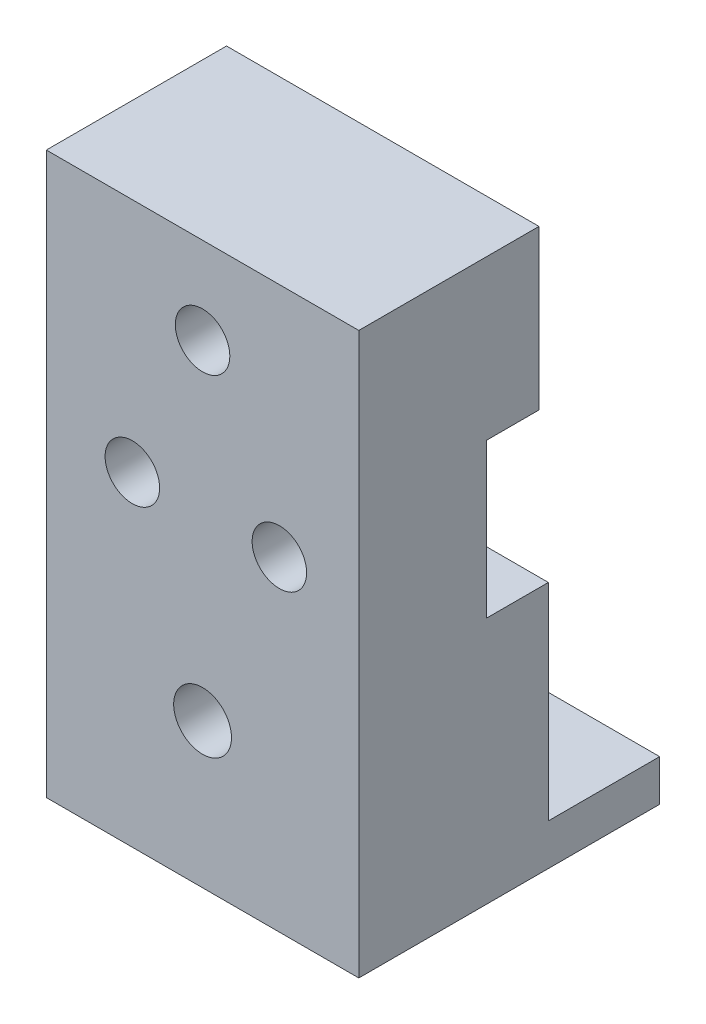
ISO-10303-21;
HEADER;
FILE_DESCRIPTION(('STEP AP214'),'2;1');
FILE_NAME('part.step','',(''),(''),'','','');
FILE_SCHEMA(('AUTOMOTIVE_DESIGN { 1 0 10303 214 1 1 1 1 }'));
ENDSEC;
DATA;
#1=APPLICATION_CONTEXT('core data for automotive mechanical design processes');
#2=APPLICATION_PROTOCOL_DEFINITION('international standard','automotive_design',2000,#1);
#3=PRODUCT_CONTEXT('',#1,'mechanical');
#4=PRODUCT('Part','Part','',(#3));
#5=PRODUCT_RELATED_PRODUCT_CATEGORY('part','',(#4));
#6=PRODUCT_DEFINITION_FORMATION('','',#4);
#7=PRODUCT_DEFINITION_CONTEXT('part definition',#1,'design');
#8=PRODUCT_DEFINITION('design','',#6,#7);
#9=PRODUCT_DEFINITION_SHAPE('','',#8);
#10=(LENGTH_UNIT() NAMED_UNIT(*) SI_UNIT(.MILLI.,.METRE.));
#11=(NAMED_UNIT(*) PLANE_ANGLE_UNIT() SI_UNIT($,.RADIAN.));
#12=(NAMED_UNIT(*) SI_UNIT($,.STERADIAN.) SOLID_ANGLE_UNIT());
#13=UNCERTAINTY_MEASURE_WITH_UNIT(LENGTH_MEASURE(1.E-05),#10,'distance_accuracy_value','');
#14=(GEOMETRIC_REPRESENTATION_CONTEXT(3) GLOBAL_UNCERTAINTY_ASSIGNED_CONTEXT((#13)) GLOBAL_UNIT_ASSIGNED_CONTEXT((#10,
#11,#12)) REPRESENTATION_CONTEXT('',''));
#15=CARTESIAN_POINT('',(0.,0.,0.));
#16=DIRECTION('',(0.,0.,1.));
#17=DIRECTION('',(1.,0.,0.));
#18=AXIS2_PLACEMENT_3D('',#15,#16,#17);
#19=CARTESIAN_POINT('',(18.915,0.,18.925));
#20=DIRECTION('',(0.,-1.,0.));
#21=DIRECTION('',(0.,0.,-1.));
#22=AXIS2_PLACEMENT_3D('',#19,#20,#21);
#23=PLANE('',#22);
#24=DIRECTION('',(0.,0.,1.));
#25=VECTOR('',#24,1.);
#26=CARTESIAN_POINT('',(-18.915,0.,18.925));
#27=LINE('',#26,#25);
#28=CARTESIAN_POINT('',(-18.915,0.,-2.88943811962644));
#29=VERTEX_POINT('',#28);
#30=CARTESIAN_POINT('',(-18.915,0.,18.925));
#31=VERTEX_POINT('',#30);
#32=EDGE_CURVE('E155',#29,#31,#27,.T.);
#33=ORIENTED_EDGE('',*,*,#32,.T.);
#34=DIRECTION('',(-1.,0.,0.));
#35=VECTOR('',#34,1.);
#36=CARTESIAN_POINT('',(18.915,0.,18.925));
#37=LINE('',#36,#35);
#38=CARTESIAN_POINT('',(18.915,0.,18.925));
#39=VERTEX_POINT('',#38);
#40=EDGE_CURVE('E11',#39,#31,#37,.T.);
#41=ORIENTED_EDGE('',*,*,#40,.F.);
#42=DIRECTION('',(0.,0.,1.));
#43=VECTOR('',#42,1.);
#44=CARTESIAN_POINT('',(18.915,0.,18.925));
#45=LINE('',#44,#43);
#46=CARTESIAN_POINT('',(18.915,0.,-2.88943811962644));
#47=VERTEX_POINT('',#46);
#48=EDGE_CURVE('E173',#47,#39,#45,.T.);
#49=ORIENTED_EDGE('',*,*,#48,.F.);
#50=DIRECTION('',(-1.,0.,0.));
#51=VECTOR('',#50,1.);
#52=CARTESIAN_POINT('',(18.915,0.,-2.88943811962644));
#53=LINE('',#52,#51);
#54=EDGE_CURVE('E151',#47,#29,#53,.T.);
#55=ORIENTED_EDGE('',*,*,#54,.T.);
#56=EDGE_LOOP('',(#33,#41,#49,#55));
#57=FACE_BOUND('',#56,.T.);
#58=ADVANCED_FACE('F45',(#57),#23,.F.);
#59=CARTESIAN_POINT('',(18.915,0.,18.925));
#60=DIRECTION('',(0.,0.,-1.));
#61=DIRECTION('',(0.,1.,0.));
#62=AXIS2_PLACEMENT_3D('',#59,#60,#61);
#63=PLANE('',#62);
#64=CARTESIAN_POINT('',(0.,-50.4,18.925));
#65=DIRECTION('',(0.,0.,1.));
#66=DIRECTION('',(1.,0.,0.));
#67=AXIS2_PLACEMENT_3D('',#64,#65,#66);
#68=CIRCLE('',#67,3.5);
#69=CARTESIAN_POINT('',(3.5,-50.4,18.925));
#70=VERTEX_POINT('',#69);
#71=EDGE_CURVE('E195',#70,#70,#68,.T.);
#72=ORIENTED_EDGE('',*,*,#71,.F.);
#73=EDGE_LOOP('',(#72));
#74=FACE_BOUND('',#73,.T.);
#75=CARTESIAN_POINT('',(0.,-10.5,18.925));
#76=DIRECTION('',(0.,0.,1.));
#77=DIRECTION('',(1.,0.,0.));
#78=AXIS2_PLACEMENT_3D('',#75,#76,#77);
#79=CIRCLE('',#78,3.3);
#80=CARTESIAN_POINT('',(3.3,-10.5,18.925));
#81=VERTEX_POINT('',#80);
#82=EDGE_CURVE('E298',#81,#81,#79,.T.);
#83=ORIENTED_EDGE('',*,*,#82,.F.);
#84=EDGE_LOOP('',(#83));
#85=FACE_BOUND('',#84,.T.);
#86=CARTESIAN_POINT('',(-8.50107698298528,-28.575,18.925));
#87=DIRECTION('',(0.,0.,1.));
#88=DIRECTION('',(1.,0.,0.));
#89=AXIS2_PLACEMENT_3D('',#86,#87,#88);
#90=CIRCLE('',#89,3.3);
#91=CARTESIAN_POINT('',(-5.20107698298528,-28.575,18.925));
#92=VERTEX_POINT('',#91);
#93=EDGE_CURVE('E301',#92,#92,#90,.T.);
#94=ORIENTED_EDGE('',*,*,#93,.F.);
#95=EDGE_LOOP('',(#94));
#96=FACE_BOUND('',#95,.T.);
#97=CARTESIAN_POINT('',(9.29892301701472,-28.575,18.925));
#98=DIRECTION('',(0.,0.,1.));
#99=DIRECTION('',(1.,0.,0.));
#100=AXIS2_PLACEMENT_3D('',#97,#98,#99);
#101=CIRCLE('',#100,3.3);
#102=CARTESIAN_POINT('',(12.5989230170147,-28.575,18.925));
#103=VERTEX_POINT('',#102);
#104=EDGE_CURVE('E305',#103,#103,#101,.T.);
#105=ORIENTED_EDGE('',*,*,#104,.F.);
#106=EDGE_LOOP('',(#105));
#107=FACE_BOUND('',#106,.T.);
#108=DIRECTION('',(0.,-1.,0.));
#109=VECTOR('',#108,1.);
#110=CARTESIAN_POINT('',(-18.915,0.,18.925));
#111=LINE('',#110,#109);
#112=CARTESIAN_POINT('',(-18.915,-67.9,18.925));
#113=VERTEX_POINT('',#112);
#114=EDGE_CURVE('E158',#31,#113,#111,.T.);
#115=ORIENTED_EDGE('',*,*,#114,.T.);
#116=DIRECTION('',(-1.,0.,0.));
#117=VECTOR('',#116,1.);
#118=CARTESIAN_POINT('',(18.915,-67.9,18.925));
#119=LINE('',#118,#117);
#120=CARTESIAN_POINT('',(18.915,-67.9,18.925));
#121=VERTEX_POINT('',#120);
#122=EDGE_CURVE('E54',#121,#113,#119,.T.);
#123=ORIENTED_EDGE('',*,*,#122,.F.);
#124=DIRECTION('',(0.,-1.,0.));
#125=VECTOR('',#124,1.);
#126=CARTESIAN_POINT('',(18.915,0.,18.925));
#127=LINE('',#126,#125);
#128=EDGE_CURVE('E112',#39,#121,#127,.T.);
#129=ORIENTED_EDGE('',*,*,#128,.F.);
#130=ORIENTED_EDGE('',*,*,#40,.T.);
#131=EDGE_LOOP('',(#115,#123,#129,#130));
#132=FACE_BOUND('',#131,.T.);
#133=ADVANCED_FACE('F221',(#74,#85,#96,#107,#132),#63,.F.);
#134=CARTESIAN_POINT('',(18.915,-67.9,-17.5));
#135=DIRECTION('',(0.,1.,0.));
#136=DIRECTION('',(0.,0.,1.));
#137=AXIS2_PLACEMENT_3D('',#134,#135,#136);
#138=PLANE('',#137);
#139=DIRECTION('',(0.,0.,-1.));
#140=VECTOR('',#139,1.);
#141=CARTESIAN_POINT('',(-18.915,-67.9,-17.5));
#142=LINE('',#141,#140);
#143=CARTESIAN_POINT('',(-18.915,-67.9,-17.5));
#144=VERTEX_POINT('',#143);
#145=EDGE_CURVE('E160',#113,#144,#142,.T.);
#146=ORIENTED_EDGE('',*,*,#145,.T.);
#147=DIRECTION('',(-1.,0.,0.));
#148=VECTOR('',#147,1.);
#149=CARTESIAN_POINT('',(18.915,-67.9,-17.5));
#150=LINE('',#149,#148);
#151=CARTESIAN_POINT('',(18.915,-67.9,-17.5));
#152=VERTEX_POINT('',#151);
#153=EDGE_CURVE('E186',#152,#144,#150,.T.);
#154=ORIENTED_EDGE('',*,*,#153,.F.);
#155=DIRECTION('',(0.,0.,-1.));
#156=VECTOR('',#155,1.);
#157=CARTESIAN_POINT('',(18.915,-67.9,-17.5));
#158=LINE('',#157,#156);
#159=EDGE_CURVE('E239',#121,#152,#158,.T.);
#160=ORIENTED_EDGE('',*,*,#159,.F.);
#161=ORIENTED_EDGE('',*,*,#122,.T.);
#162=EDGE_LOOP('',(#146,#154,#160,#161));
#163=FACE_BOUND('',#162,.T.);
#164=ADVANCED_FACE('F227',(#163),#138,.F.);
#165=CARTESIAN_POINT('',(18.915,-67.9,-17.5));
#166=DIRECTION('',(0.,0.,1.));
#167=DIRECTION('',(1.,0.,0.));
#168=AXIS2_PLACEMENT_3D('',#165,#166,#167);
#169=PLANE('',#168);
#170=DIRECTION('',(0.,1.,0.));
#171=VECTOR('',#170,1.);
#172=CARTESIAN_POINT('',(-18.915,-67.9,-17.5));
#173=LINE('',#172,#171);
#174=CARTESIAN_POINT('',(-18.915,-62.9,-17.5));
#175=VERTEX_POINT('',#174);
#176=EDGE_CURVE('E162',#144,#175,#173,.T.);
#177=ORIENTED_EDGE('',*,*,#176,.T.);
#178=DIRECTION('',(-1.,0.,0.));
#179=VECTOR('',#178,1.);
#180=CARTESIAN_POINT('',(18.915,-62.9,-17.5));
#181=LINE('',#180,#179);
#182=CARTESIAN_POINT('',(18.915,-62.9,-17.5));
#183=VERTEX_POINT('',#182);
#184=EDGE_CURVE('E183',#183,#175,#181,.T.);
#185=ORIENTED_EDGE('',*,*,#184,.F.);
#186=DIRECTION('',(0.,1.,0.));
#187=VECTOR('',#186,1.);
#188=CARTESIAN_POINT('',(18.915,-67.9,-17.5));
#189=LINE('',#188,#187);
#190=EDGE_CURVE('E241',#152,#183,#189,.T.);
#191=ORIENTED_EDGE('',*,*,#190,.F.);
#192=ORIENTED_EDGE('',*,*,#153,.T.);
#193=EDGE_LOOP('',(#177,#185,#191,#192));
#194=FACE_BOUND('',#193,.T.);
#195=ADVANCED_FACE('F263',(#194),#169,.F.);
#196=CARTESIAN_POINT('',(18.915,-62.9,-4.02516782305241));
#197=DIRECTION('',(0.,-1.,0.));
#198=DIRECTION('',(0.,0.,-1.));
#199=AXIS2_PLACEMENT_3D('',#196,#197,#198);
#200=PLANE('',#199);
#201=DIRECTION('',(0.,0.,1.));
#202=VECTOR('',#201,1.);
#203=CARTESIAN_POINT('',(-18.915,-62.9,-4.02516782305241));
#204=LINE('',#203,#202);
#205=CARTESIAN_POINT('',(-18.915,-62.9,-4.02516782305241));
#206=VERTEX_POINT('',#205);
#207=EDGE_CURVE('E164',#175,#206,#204,.T.);
#208=ORIENTED_EDGE('',*,*,#207,.T.);
#209=DIRECTION('',(-1.,0.,0.));
#210=VECTOR('',#209,1.);
#211=CARTESIAN_POINT('',(18.915,-62.9,-4.02516782305241));
#212=LINE('',#211,#210);
#213=CARTESIAN_POINT('',(18.915,-62.9,-4.02516782305241));
#214=VERTEX_POINT('',#213);
#215=EDGE_CURVE('E180',#214,#206,#212,.T.);
#216=ORIENTED_EDGE('',*,*,#215,.F.);
#217=DIRECTION('',(0.,0.,1.));
#218=VECTOR('',#217,1.);
#219=CARTESIAN_POINT('',(18.915,-62.9,-4.02516782305241));
#220=LINE('',#219,#218);
#221=EDGE_CURVE('E243',#183,#214,#220,.T.);
#222=ORIENTED_EDGE('',*,*,#221,.F.);
#223=ORIENTED_EDGE('',*,*,#184,.T.);
#224=EDGE_LOOP('',(#208,#216,#222,#223));
#225=FACE_BOUND('',#224,.T.);
#226=ADVANCED_FACE('F260',(#225),#200,.F.);
#227=CARTESIAN_POINT('',(18.915,-37.9,-4.02516782305241));
#228=DIRECTION('',(0.,0.,1.));
#229=DIRECTION('',(1.,0.,0.));
#230=AXIS2_PLACEMENT_3D('',#227,#228,#229);
#231=PLANE('',#230);
#232=CARTESIAN_POINT('',(0.,-50.4,-4.02516782305241));
#233=DIRECTION('',(0.,0.,1.));
#234=DIRECTION('',(1.,0.,0.));
#235=AXIS2_PLACEMENT_3D('',#232,#233,#234);
#236=CIRCLE('',#235,3.5);
#237=CARTESIAN_POINT('',(3.5,-50.4,-4.02516782305241));
#238=VERTEX_POINT('',#237);
#239=EDGE_CURVE('E48',#238,#238,#236,.T.);
#240=ORIENTED_EDGE('',*,*,#239,.T.);
#241=EDGE_LOOP('',(#240));
#242=FACE_BOUND('',#241,.T.);
#243=DIRECTION('',(0.,1.,0.));
#244=VECTOR('',#243,1.);
#245=CARTESIAN_POINT('',(-18.915,-37.9,-4.02516782305241));
#246=LINE('',#245,#244);
#247=CARTESIAN_POINT('',(-18.915,-37.9,-4.02516782305241));
#248=VERTEX_POINT('',#247);
#249=EDGE_CURVE('E166',#206,#248,#246,.T.);
#250=ORIENTED_EDGE('',*,*,#249,.T.);
#251=DIRECTION('',(-1.,0.,0.));
#252=VECTOR('',#251,1.);
#253=CARTESIAN_POINT('',(18.915,-37.9,-4.02516782305241));
#254=LINE('',#253,#252);
#255=CARTESIAN_POINT('',(18.915,-37.9,-4.02516782305241));
#256=VERTEX_POINT('',#255);
#257=EDGE_CURVE('E177',#256,#248,#254,.T.);
#258=ORIENTED_EDGE('',*,*,#257,.F.);
#259=DIRECTION('',(0.,1.,0.));
#260=VECTOR('',#259,1.);
#261=CARTESIAN_POINT('',(18.915,-37.9,-4.02516782305241));
#262=LINE('',#261,#260);
#263=EDGE_CURVE('E249',#214,#256,#262,.T.);
#264=ORIENTED_EDGE('',*,*,#263,.F.);
#265=ORIENTED_EDGE('',*,*,#215,.T.);
#266=EDGE_LOOP('',(#250,#258,#264,#265));
#267=FACE_BOUND('',#266,.T.);
#268=ADVANCED_FACE('F204',(#242,#267),#231,.F.);
#269=CARTESIAN_POINT('',(18.915,-37.9,3.46056188037356));
#270=DIRECTION('',(0.,-1.,0.));
#271=DIRECTION('',(0.,0.,-1.));
#272=AXIS2_PLACEMENT_3D('',#269,#270,#271);
#273=PLANE('',#272);
#274=DIRECTION('',(0.,0.,1.));
#275=VECTOR('',#274,1.);
#276=CARTESIAN_POINT('',(-18.915,-37.9,3.46056188037356));
#277=LINE('',#276,#275);
#278=CARTESIAN_POINT('',(-18.915,-37.9,3.46056188037356));
#279=VERTEX_POINT('',#278);
#280=EDGE_CURVE('E168',#248,#279,#277,.T.);
#281=ORIENTED_EDGE('',*,*,#280,.T.);
#282=DIRECTION('',(-1.,0.,0.));
#283=VECTOR('',#282,1.);
#284=CARTESIAN_POINT('',(18.915,-37.9,3.46056188037356));
#285=LINE('',#284,#283);
#286=CARTESIAN_POINT('',(18.915,-37.9,3.46056188037356));
#287=VERTEX_POINT('',#286);
#288=EDGE_CURVE('E146',#287,#279,#285,.T.);
#289=ORIENTED_EDGE('',*,*,#288,.F.);
#290=DIRECTION('',(0.,0.,1.));
#291=VECTOR('',#290,1.);
#292=CARTESIAN_POINT('',(18.915,-37.9,3.46056188037356));
#293=LINE('',#292,#291);
#294=EDGE_CURVE('E137',#256,#287,#293,.T.);
#295=ORIENTED_EDGE('',*,*,#294,.F.);
#296=ORIENTED_EDGE('',*,*,#257,.T.);
#297=EDGE_LOOP('',(#281,#289,#295,#296));
#298=FACE_BOUND('',#297,.T.);
#299=ADVANCED_FACE('F257',(#298),#273,.F.);
#300=CARTESIAN_POINT('',(18.915,-19.25,3.46056188037356));
#301=DIRECTION('',(0.,0.,1.));
#302=DIRECTION('',(0.,-1.,0.));
#303=AXIS2_PLACEMENT_3D('',#300,#301,#302);
#304=PLANE('',#303);
#305=CARTESIAN_POINT('',(-8.50107698298528,-28.575,3.46056188037356));
#306=DIRECTION('',(0.,0.,1.));
#307=DIRECTION('',(0.,-1.,0.));
#308=AXIS2_PLACEMENT_3D('',#305,#306,#307);
#309=CIRCLE('',#308,3.3);
#310=CARTESIAN_POINT('',(-8.50107698298528,-31.875,3.46056188037356));
#311=VERTEX_POINT('',#310);
#312=EDGE_CURVE('E197',#311,#311,#309,.T.);
#313=ORIENTED_EDGE('',*,*,#312,.T.);
#314=EDGE_LOOP('',(#313));
#315=FACE_BOUND('',#314,.T.);
#316=CARTESIAN_POINT('',(9.29892301701472,-28.575,3.46056188037356));
#317=DIRECTION('',(0.,0.,1.));
#318=DIRECTION('',(0.,-1.,0.));
#319=AXIS2_PLACEMENT_3D('',#316,#317,#318);
#320=CIRCLE('',#319,3.3);
#321=CARTESIAN_POINT('',(9.29892301701472,-31.875,3.46056188037356));
#322=VERTEX_POINT('',#321);
#323=EDGE_CURVE('E194',#322,#322,#320,.T.);
#324=ORIENTED_EDGE('',*,*,#323,.T.);
#325=EDGE_LOOP('',(#324));
#326=FACE_BOUND('',#325,.T.);
#327=DIRECTION('',(0.,1.,0.));
#328=VECTOR('',#327,1.);
#329=CARTESIAN_POINT('',(-18.915,-19.25,3.46056188037356));
#330=LINE('',#329,#328);
#331=CARTESIAN_POINT('',(-18.915,-19.25,3.46056188037356));
#332=VERTEX_POINT('',#331);
#333=EDGE_CURVE('E145',#279,#332,#330,.T.);
#334=ORIENTED_EDGE('',*,*,#333,.T.);
#335=DIRECTION('',(-1.,0.,0.));
#336=VECTOR('',#335,1.);
#337=CARTESIAN_POINT('',(18.915,-19.25,3.46056188037356));
#338=LINE('',#337,#336);
#339=CARTESIAN_POINT('',(18.915,-19.25,3.46056188037356));
#340=VERTEX_POINT('',#339);
#341=EDGE_CURVE('E142',#340,#332,#338,.T.);
#342=ORIENTED_EDGE('',*,*,#341,.F.);
#343=DIRECTION('',(0.,1.,0.));
#344=VECTOR('',#343,1.);
#345=CARTESIAN_POINT('',(18.915,-19.25,3.46056188037356));
#346=LINE('',#345,#344);
#347=EDGE_CURVE('E131',#287,#340,#346,.T.);
#348=ORIENTED_EDGE('',*,*,#347,.F.);
#349=ORIENTED_EDGE('',*,*,#288,.T.);
#350=EDGE_LOOP('',(#334,#342,#348,#349));
#351=FACE_BOUND('',#350,.T.);
#352=ADVANCED_FACE('F143',(#315,#326,#351),#304,.F.);
#353=CARTESIAN_POINT('',(18.915,-19.25,-2.88943811962644));
#354=DIRECTION('',(0.,1.,0.));
#355=DIRECTION('',(0.,0.,1.));
#356=AXIS2_PLACEMENT_3D('',#353,#354,#355);
#357=PLANE('',#356);
#358=DIRECTION('',(0.,0.,-1.));
#359=VECTOR('',#358,1.);
#360=CARTESIAN_POINT('',(-18.915,-19.25,-2.88943811962644));
#361=LINE('',#360,#359);
#362=CARTESIAN_POINT('',(-18.915,-19.25,-2.88943811962644));
#363=VERTEX_POINT('',#362);
#364=EDGE_CURVE('E98',#332,#363,#361,.T.);
#365=ORIENTED_EDGE('',*,*,#364,.T.);
#366=DIRECTION('',(-1.,0.,0.));
#367=VECTOR('',#366,1.);
#368=CARTESIAN_POINT('',(18.915,-19.25,-2.88943811962644));
#369=LINE('',#368,#367);
#370=CARTESIAN_POINT('',(18.915,-19.25,-2.88943811962644));
#371=VERTEX_POINT('',#370);
#372=EDGE_CURVE('E147',#371,#363,#369,.T.);
#373=ORIENTED_EDGE('',*,*,#372,.F.);
#374=DIRECTION('',(0.,0.,-1.));
#375=VECTOR('',#374,1.);
#376=CARTESIAN_POINT('',(18.915,-19.25,-2.88943811962644));
#377=LINE('',#376,#375);
#378=EDGE_CURVE('E135',#340,#371,#377,.T.);
#379=ORIENTED_EDGE('',*,*,#378,.F.);
#380=ORIENTED_EDGE('',*,*,#341,.T.);
#381=EDGE_LOOP('',(#365,#373,#379,#380));
#382=FACE_BOUND('',#381,.T.);
#383=ADVANCED_FACE('F149',(#382),#357,.F.);
#384=CARTESIAN_POINT('',(18.915,0.,-2.88943811962644));
#385=DIRECTION('',(0.,0.,1.));
#386=DIRECTION('',(0.,-1.,0.));
#387=AXIS2_PLACEMENT_3D('',#384,#385,#386);
#388=PLANE('',#387);
#389=CARTESIAN_POINT('',(0.,-10.5,-2.88943811962644));
#390=DIRECTION('',(0.,0.,1.));
#391=DIRECTION('',(0.,-1.,0.));
#392=AXIS2_PLACEMENT_3D('',#389,#390,#391);
#393=CIRCLE('',#392,3.3);
#394=CARTESIAN_POINT('',(0.,-13.8,-2.88943811962644));
#395=VERTEX_POINT('',#394);
#396=EDGE_CURVE('E191',#395,#395,#393,.T.);
#397=ORIENTED_EDGE('',*,*,#396,.T.);
#398=EDGE_LOOP('',(#397));
#399=FACE_BOUND('',#398,.T.);
#400=DIRECTION('',(0.,1.,0.));
#401=VECTOR('',#400,1.);
#402=CARTESIAN_POINT('',(-18.915,0.,-2.88943811962644));
#403=LINE('',#402,#401);
#404=EDGE_CURVE('E104',#363,#29,#403,.T.);
#405=ORIENTED_EDGE('',*,*,#404,.T.);
#406=ORIENTED_EDGE('',*,*,#54,.F.);
#407=DIRECTION('',(0.,1.,0.));
#408=VECTOR('',#407,1.);
#409=CARTESIAN_POINT('',(18.915,0.,-2.88943811962644));
#410=LINE('',#409,#408);
#411=EDGE_CURVE('E63',#371,#47,#410,.T.);
#412=ORIENTED_EDGE('',*,*,#411,.F.);
#413=ORIENTED_EDGE('',*,*,#372,.T.);
#414=EDGE_LOOP('',(#405,#406,#412,#413));
#415=FACE_BOUND('',#414,.T.);
#416=ADVANCED_FACE('F280',(#399,#415),#388,.F.);
#417=CARTESIAN_POINT('',(18.915,0.,0.));
#418=DIRECTION('',(-1.,0.,0.));
#419=DIRECTION('',(0.,0.,1.));
#420=AXIS2_PLACEMENT_3D('',#417,#418,#419);
#421=PLANE('',#420);
#422=ORIENTED_EDGE('',*,*,#48,.T.);
#423=ORIENTED_EDGE('',*,*,#128,.T.);
#424=ORIENTED_EDGE('',*,*,#159,.T.);
#425=ORIENTED_EDGE('',*,*,#190,.T.);
#426=ORIENTED_EDGE('',*,*,#221,.T.);
#427=ORIENTED_EDGE('',*,*,#263,.T.);
#428=ORIENTED_EDGE('',*,*,#294,.T.);
#429=ORIENTED_EDGE('',*,*,#347,.T.);
#430=ORIENTED_EDGE('',*,*,#378,.T.);
#431=ORIENTED_EDGE('',*,*,#411,.T.);
#432=EDGE_LOOP('',(#422,#423,#424,#425,#426,#427,#428,#429,#430,#431));
#433=FACE_BOUND('',#432,.T.);
#434=ADVANCED_FACE('F133',(#433),#421,.F.);
#435=CARTESIAN_POINT('',(-18.915,0.,0.));
#436=DIRECTION('',(-1.,0.,0.));
#437=DIRECTION('',(0.,0.,1.));
#438=AXIS2_PLACEMENT_3D('',#435,#436,#437);
#439=PLANE('',#438);
#440=ORIENTED_EDGE('',*,*,#32,.F.);
#441=ORIENTED_EDGE('',*,*,#404,.F.);
#442=ORIENTED_EDGE('',*,*,#364,.F.);
#443=ORIENTED_EDGE('',*,*,#333,.F.);
#444=ORIENTED_EDGE('',*,*,#280,.F.);
#445=ORIENTED_EDGE('',*,*,#249,.F.);
#446=ORIENTED_EDGE('',*,*,#207,.F.);
#447=ORIENTED_EDGE('',*,*,#176,.F.);
#448=ORIENTED_EDGE('',*,*,#145,.F.);
#449=ORIENTED_EDGE('',*,*,#114,.F.);
#450=EDGE_LOOP('',(#440,#441,#442,#443,#444,#445,#446,#447,#448,#449));
#451=FACE_BOUND('',#450,.T.);
#452=ADVANCED_FACE('F233',(#451),#439,.T.);
#453=CARTESIAN_POINT('',(0.,-10.5,-17.5));
#454=DIRECTION('',(0.,0.,1.));
#455=DIRECTION('',(1.,0.,0.));
#456=AXIS2_PLACEMENT_3D('',#453,#454,#455);
#457=CYLINDRICAL_SURFACE('',#456,3.3);
#458=ORIENTED_EDGE('',*,*,#82,.T.);
#459=EDGE_LOOP('',(#458));
#460=FACE_BOUND('',#459,.T.);
#461=ORIENTED_EDGE('',*,*,#396,.F.);
#462=EDGE_LOOP('',(#461));
#463=FACE_BOUND('',#462,.T.);
#464=ADVANCED_FACE('F286',(#460,#463),#457,.F.);
#465=CARTESIAN_POINT('',(9.29892301701472,-28.575,-17.5));
#466=DIRECTION('',(0.,0.,1.));
#467=DIRECTION('',(1.,0.,0.));
#468=AXIS2_PLACEMENT_3D('',#465,#466,#467);
#469=CYLINDRICAL_SURFACE('',#468,3.3);
#470=ORIENTED_EDGE('',*,*,#104,.T.);
#471=EDGE_LOOP('',(#470));
#472=FACE_BOUND('',#471,.T.);
#473=ORIENTED_EDGE('',*,*,#323,.F.);
#474=EDGE_LOOP('',(#473));
#475=FACE_BOUND('',#474,.T.);
#476=ADVANCED_FACE('F215',(#472,#475),#469,.F.);
#477=CARTESIAN_POINT('',(-8.50107698298528,-28.575,-17.5));
#478=DIRECTION('',(0.,0.,1.));
#479=DIRECTION('',(1.,0.,0.));
#480=AXIS2_PLACEMENT_3D('',#477,#478,#479);
#481=CYLINDRICAL_SURFACE('',#480,3.3);
#482=ORIENTED_EDGE('',*,*,#93,.T.);
#483=EDGE_LOOP('',(#482));
#484=FACE_BOUND('',#483,.T.);
#485=ORIENTED_EDGE('',*,*,#312,.F.);
#486=EDGE_LOOP('',(#485));
#487=FACE_BOUND('',#486,.T.);
#488=ADVANCED_FACE('F209',(#484,#487),#481,.F.);
#489=CARTESIAN_POINT('',(0.,-50.4,-17.5));
#490=DIRECTION('',(0.,0.,1.));
#491=DIRECTION('',(1.,0.,0.));
#492=AXIS2_PLACEMENT_3D('',#489,#490,#491);
#493=CYLINDRICAL_SURFACE('',#492,3.5);
#494=ORIENTED_EDGE('',*,*,#71,.T.);
#495=EDGE_LOOP('',(#494));
#496=FACE_BOUND('',#495,.T.);
#497=ORIENTED_EDGE('',*,*,#239,.F.);
#498=EDGE_LOOP('',(#497));
#499=FACE_BOUND('',#498,.T.);
#500=ADVANCED_FACE('F207',(#496,#499),#493,.F.);
#501=CLOSED_SHELL('',(#58,#133,#164,#195,#226,#268,#299,#352,#383,#416,#434,#452,#464,#476,#488,#500));
#502=MANIFOLD_SOLID_BREP('B2',#501);
#503=ADVANCED_BREP_SHAPE_REPRESENTATION('',(#18,#502),#14);
#504=SHAPE_DEFINITION_REPRESENTATION(#9,#503);
ENDSEC;
END-ISO-10303-21;
